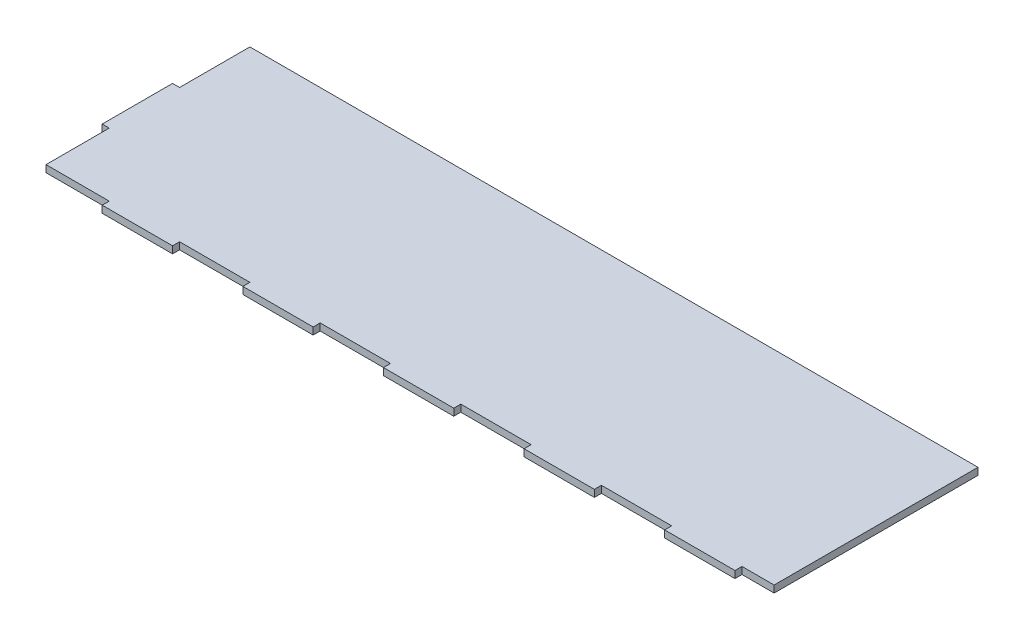
ISO-10303-21;
HEADER;
FILE_DESCRIPTION(('STEP AP214'),'2;1');
FILE_NAME('part.step','',(''),(''),'','','');
FILE_SCHEMA(('AUTOMOTIVE_DESIGN { 1 0 10303 214 1 1 1 1 }'));
ENDSEC;
DATA;
#1=APPLICATION_CONTEXT('core data for automotive mechanical design processes');
#2=APPLICATION_PROTOCOL_DEFINITION('international standard','automotive_design',2000,#1);
#3=PRODUCT_CONTEXT('',#1,'mechanical');
#4=PRODUCT('Part','Part','',(#3));
#5=PRODUCT_RELATED_PRODUCT_CATEGORY('part','',(#4));
#6=PRODUCT_DEFINITION_FORMATION('','',#4);
#7=PRODUCT_DEFINITION_CONTEXT('part definition',#1,'design');
#8=PRODUCT_DEFINITION('design','',#6,#7);
#9=PRODUCT_DEFINITION_SHAPE('','',#8);
#10=(LENGTH_UNIT() NAMED_UNIT(*) SI_UNIT(.MILLI.,.METRE.));
#11=(NAMED_UNIT(*) PLANE_ANGLE_UNIT() SI_UNIT($,.RADIAN.));
#12=(NAMED_UNIT(*) SI_UNIT($,.STERADIAN.) SOLID_ANGLE_UNIT());
#13=UNCERTAINTY_MEASURE_WITH_UNIT(LENGTH_MEASURE(1.E-05),#10,'distance_accuracy_value','');
#14=(GEOMETRIC_REPRESENTATION_CONTEXT(3) GLOBAL_UNCERTAINTY_ASSIGNED_CONTEXT((#13)) GLOBAL_UNIT_ASSIGNED_CONTEXT((#10,
#11,#12)) REPRESENTATION_CONTEXT('',''));
#15=CARTESIAN_POINT('',(0.,0.,0.));
#16=DIRECTION('',(0.,0.,1.));
#17=DIRECTION('',(1.,0.,0.));
#18=AXIS2_PLACEMENT_3D('',#15,#16,#17);
#19=CARTESIAN_POINT('',(-1.29499999999999,0.,0.));
#20=DIRECTION('',(1.,0.,0.));
#21=DIRECTION('',(0.,0.,-1.));
#22=AXIS2_PLACEMENT_3D('',#19,#20,#21);
#23=PLANE('',#22);
#24=DIRECTION('',(0.,0.,1.));
#25=VECTOR('',#24,1.);
#26=CARTESIAN_POINT('',(-1.29499999999999,0.,0.));
#27=LINE('',#26,#25);
#28=CARTESIAN_POINT('',(-1.29499999999999,0.,-45.));
#29=VERTEX_POINT('',#28);
#30=CARTESIAN_POINT('',(-1.29499999999999,0.,42.));
#31=VERTEX_POINT('',#30);
#32=EDGE_CURVE('E241',#29,#31,#27,.T.);
#33=ORIENTED_EDGE('',*,*,#32,.F.);
#34=DIRECTION('',(0.,1.,0.));
#35=VECTOR('',#34,1.);
#36=CARTESIAN_POINT('',(-1.29499999999999,3.,-45.));
#37=LINE('',#36,#35);
#38=CARTESIAN_POINT('',(-1.29499999999999,3.,-45.));
#39=VERTEX_POINT('',#38);
#40=EDGE_CURVE('E65',#29,#39,#37,.T.);
#41=ORIENTED_EDGE('',*,*,#40,.T.);
#42=DIRECTION('',(0.,0.,1.));
#43=VECTOR('',#42,1.);
#44=CARTESIAN_POINT('',(-1.29499999999999,3.,0.));
#45=LINE('',#44,#43);
#46=CARTESIAN_POINT('',(-1.29499999999999,3.,42.));
#47=VERTEX_POINT('',#46);
#48=EDGE_CURVE('E58',#39,#47,#45,.T.);
#49=ORIENTED_EDGE('',*,*,#48,.T.);
#50=DIRECTION('',(0.,-1.,0.));
#51=VECTOR('',#50,1.);
#52=CARTESIAN_POINT('',(-1.29499999999999,0.,42.));
#53=LINE('',#52,#51);
#54=EDGE_CURVE('E12',#47,#31,#53,.T.);
#55=ORIENTED_EDGE('',*,*,#54,.T.);
#56=EDGE_LOOP('',(#33,#41,#49,#55));
#57=FACE_BOUND('',#56,.T.);
#58=ADVANCED_FACE('F42',(#57),#23,.T.);
#59=CARTESIAN_POINT('',(-315.,3.,-45.));
#60=DIRECTION('',(0.,0.,1.));
#61=DIRECTION('',(1.,0.,0.));
#62=AXIS2_PLACEMENT_3D('',#59,#60,#61);
#63=PLANE('',#62);
#64=ORIENTED_EDGE('',*,*,#40,.F.);
#65=DIRECTION('',(-1.,0.,0.));
#66=VECTOR('',#65,1.);
#67=CARTESIAN_POINT('',(-315.,0.,-45.));
#68=LINE('',#67,#66);
#69=CARTESIAN_POINT('',(-312.,0.,-45.));
#70=VERTEX_POINT('',#69);
#71=EDGE_CURVE('E244',#29,#70,#68,.T.);
#72=ORIENTED_EDGE('',*,*,#71,.T.);
#73=DIRECTION('',(0.,1.,0.));
#74=VECTOR('',#73,1.);
#75=CARTESIAN_POINT('',(-312.,0.,-45.));
#76=LINE('',#75,#74);
#77=CARTESIAN_POINT('',(-312.,3.,-45.));
#78=VERTEX_POINT('',#77);
#79=EDGE_CURVE('E286',#70,#78,#76,.T.);
#80=ORIENTED_EDGE('',*,*,#79,.T.);
#81=DIRECTION('',(-1.,0.,0.));
#82=VECTOR('',#81,1.);
#83=CARTESIAN_POINT('',(-315.,3.,-45.));
#84=LINE('',#83,#82);
#85=EDGE_CURVE('E475',#39,#78,#84,.T.);
#86=ORIENTED_EDGE('',*,*,#85,.F.);
#87=EDGE_LOOP('',(#64,#72,#80,#86));
#88=FACE_BOUND('',#87,.T.);
#89=ADVANCED_FACE('F44',(#88),#63,.F.);
#90=CARTESIAN_POINT('',(0.,3.,0.));
#91=DIRECTION('',(0.,-1.,0.));
#92=DIRECTION('',(0.,0.,-1.));
#93=AXIS2_PLACEMENT_3D('',#90,#91,#92);
#94=PLANE('',#93);
#95=ORIENTED_EDGE('',*,*,#48,.F.);
#96=ORIENTED_EDGE('',*,*,#85,.T.);
#97=DIRECTION('',(0.,0.,-1.));
#98=VECTOR('',#97,1.);
#99=CARTESIAN_POINT('',(-312.,3.,-45.));
#100=LINE('',#99,#98);
#101=CARTESIAN_POINT('',(-312.,3.,-15.));
#102=VERTEX_POINT('',#101);
#103=EDGE_CURVE('E276',#102,#78,#100,.T.);
#104=ORIENTED_EDGE('',*,*,#103,.F.);
#105=DIRECTION('',(1.,0.,0.));
#106=VECTOR('',#105,1.);
#107=CARTESIAN_POINT('',(-315.,3.,-15.));
#108=LINE('',#107,#106);
#109=CARTESIAN_POINT('',(-315.,3.,-15.));
#110=VERTEX_POINT('',#109);
#111=EDGE_CURVE('E270',#110,#102,#108,.T.);
#112=ORIENTED_EDGE('',*,*,#111,.F.);
#113=DIRECTION('',(0.,0.,1.));
#114=VECTOR('',#113,1.);
#115=CARTESIAN_POINT('',(-315.,3.,45.));
#116=LINE('',#115,#114);
#117=CARTESIAN_POINT('',(-315.,3.,15.));
#118=VERTEX_POINT('',#117);
#119=EDGE_CURVE('E478',#110,#118,#116,.T.);
#120=ORIENTED_EDGE('',*,*,#119,.T.);
#121=DIRECTION('',(-1.,0.,0.));
#122=VECTOR('',#121,1.);
#123=CARTESIAN_POINT('',(-315.,3.,15.));
#124=LINE('',#123,#122);
#125=CARTESIAN_POINT('',(-312.,3.,15.));
#126=VERTEX_POINT('',#125);
#127=EDGE_CURVE('E257',#126,#118,#124,.T.);
#128=ORIENTED_EDGE('',*,*,#127,.F.);
#129=DIRECTION('',(0.,0.,-1.));
#130=VECTOR('',#129,1.);
#131=CARTESIAN_POINT('',(-312.,3.,42.));
#132=LINE('',#131,#130);
#133=CARTESIAN_POINT('',(-312.,3.,42.));
#134=VERTEX_POINT('',#133);
#135=EDGE_CURVE('E251',#134,#126,#132,.T.);
#136=ORIENTED_EDGE('',*,*,#135,.F.);
#137=DIRECTION('',(-1.,0.,0.));
#138=VECTOR('',#137,1.);
#139=CARTESIAN_POINT('',(-315.,3.,42.));
#140=LINE('',#139,#138);
#141=CARTESIAN_POINT('',(-285.,3.,42.));
#142=VERTEX_POINT('',#141);
#143=EDGE_CURVE('E388',#142,#134,#140,.T.);
#144=ORIENTED_EDGE('',*,*,#143,.F.);
#145=DIRECTION('',(0.,0.,-1.));
#146=VECTOR('',#145,1.);
#147=CARTESIAN_POINT('',(-285.,3.,45.));
#148=LINE('',#147,#146);
#149=CARTESIAN_POINT('',(-285.,3.,45.));
#150=VERTEX_POINT('',#149);
#151=EDGE_CURVE('E290',#150,#142,#148,.T.);
#152=ORIENTED_EDGE('',*,*,#151,.F.);
#153=DIRECTION('',(1.,0.,0.));
#154=VECTOR('',#153,1.);
#155=CARTESIAN_POINT('',(-315.,3.,45.));
#156=LINE('',#155,#154);
#157=CARTESIAN_POINT('',(-255.,3.,45.));
#158=VERTEX_POINT('',#157);
#159=EDGE_CURVE('E504',#150,#158,#156,.T.);
#160=ORIENTED_EDGE('',*,*,#159,.T.);
#161=DIRECTION('',(0.,0.,1.));
#162=VECTOR('',#161,1.);
#163=CARTESIAN_POINT('',(-255.,3.,45.));
#164=LINE('',#163,#162);
#165=CARTESIAN_POINT('',(-255.,3.,42.));
#166=VERTEX_POINT('',#165);
#167=EDGE_CURVE('E429',#166,#158,#164,.T.);
#168=ORIENTED_EDGE('',*,*,#167,.F.);
#169=DIRECTION('',(-1.,0.,0.));
#170=VECTOR('',#169,1.);
#171=CARTESIAN_POINT('',(-255.,3.,42.));
#172=LINE('',#171,#170);
#173=CARTESIAN_POINT('',(-225.,3.,42.));
#174=VERTEX_POINT('',#173);
#175=EDGE_CURVE('E444',#174,#166,#172,.T.);
#176=ORIENTED_EDGE('',*,*,#175,.F.);
#177=DIRECTION('',(0.,0.,-1.));
#178=VECTOR('',#177,1.);
#179=CARTESIAN_POINT('',(-225.,3.,45.));
#180=LINE('',#179,#178);
#181=CARTESIAN_POINT('',(-225.,3.,45.));
#182=VERTEX_POINT('',#181);
#183=EDGE_CURVE('E456',#182,#174,#180,.T.);
#184=ORIENTED_EDGE('',*,*,#183,.F.);
#185=CARTESIAN_POINT('',(-195.,3.,45.));
#186=VERTEX_POINT('',#185);
#187=EDGE_CURVE('E488',#182,#186,#156,.T.);
#188=ORIENTED_EDGE('',*,*,#187,.T.);
#189=DIRECTION('',(0.,0.,1.));
#190=VECTOR('',#189,1.);
#191=CARTESIAN_POINT('',(-195.,3.,45.));
#192=LINE('',#191,#190);
#193=CARTESIAN_POINT('',(-195.,3.,42.));
#194=VERTEX_POINT('',#193);
#195=EDGE_CURVE('E324',#194,#186,#192,.T.);
#196=ORIENTED_EDGE('',*,*,#195,.F.);
#197=DIRECTION('',(-1.,0.,0.));
#198=VECTOR('',#197,1.);
#199=CARTESIAN_POINT('',(-195.,3.,42.));
#200=LINE('',#199,#198);
#201=CARTESIAN_POINT('',(-165.,3.,42.));
#202=VERTEX_POINT('',#201);
#203=EDGE_CURVE('E408',#202,#194,#200,.T.);
#204=ORIENTED_EDGE('',*,*,#203,.F.);
#205=DIRECTION('',(0.,0.,-1.));
#206=VECTOR('',#205,1.);
#207=CARTESIAN_POINT('',(-165.,3.,45.));
#208=LINE('',#207,#206);
#209=CARTESIAN_POINT('',(-165.,3.,45.));
#210=VERTEX_POINT('',#209);
#211=EDGE_CURVE('E419',#210,#202,#208,.T.);
#212=ORIENTED_EDGE('',*,*,#211,.F.);
#213=CARTESIAN_POINT('',(-135.,3.,45.));
#214=VERTEX_POINT('',#213);
#215=EDGE_CURVE('E636',#210,#214,#156,.T.);
#216=ORIENTED_EDGE('',*,*,#215,.T.);
#217=DIRECTION('',(0.,0.,1.));
#218=VECTOR('',#217,1.);
#219=CARTESIAN_POINT('',(-135.,3.,45.));
#220=LINE('',#219,#218);
#221=CARTESIAN_POINT('',(-135.,3.,42.));
#222=VERTEX_POINT('',#221);
#223=EDGE_CURVE('E310',#222,#214,#220,.T.);
#224=ORIENTED_EDGE('',*,*,#223,.F.);
#225=DIRECTION('',(-1.,0.,0.));
#226=VECTOR('',#225,1.);
#227=CARTESIAN_POINT('',(-135.,3.,42.));
#228=LINE('',#227,#226);
#229=CARTESIAN_POINT('',(-105.,3.,42.));
#230=VERTEX_POINT('',#229);
#231=EDGE_CURVE('E301',#230,#222,#228,.T.);
#232=ORIENTED_EDGE('',*,*,#231,.F.);
#233=DIRECTION('',(0.,0.,-1.));
#234=VECTOR('',#233,1.);
#235=CARTESIAN_POINT('',(-105.,3.,45.));
#236=LINE('',#235,#234);
#237=CARTESIAN_POINT('',(-105.,3.,45.));
#238=VERTEX_POINT('',#237);
#239=EDGE_CURVE('E313',#238,#230,#236,.T.);
#240=ORIENTED_EDGE('',*,*,#239,.F.);
#241=CARTESIAN_POINT('',(-75.,3.,45.));
#242=VERTEX_POINT('',#241);
#243=EDGE_CURVE('E487',#238,#242,#156,.T.);
#244=ORIENTED_EDGE('',*,*,#243,.T.);
#245=DIRECTION('',(0.,0.,1.));
#246=VECTOR('',#245,1.);
#247=CARTESIAN_POINT('',(-75.,3.,45.));
#248=LINE('',#247,#246);
#249=CARTESIAN_POINT('',(-75.,3.,42.));
#250=VERTEX_POINT('',#249);
#251=EDGE_CURVE('E348',#250,#242,#248,.T.);
#252=ORIENTED_EDGE('',*,*,#251,.F.);
#253=DIRECTION('',(-1.,0.,0.));
#254=VECTOR('',#253,1.);
#255=CARTESIAN_POINT('',(-75.,3.,42.));
#256=LINE('',#255,#254);
#257=CARTESIAN_POINT('',(-45.,3.,42.));
#258=VERTEX_POINT('',#257);
#259=EDGE_CURVE('E339',#258,#250,#256,.T.);
#260=ORIENTED_EDGE('',*,*,#259,.F.);
#261=DIRECTION('',(0.,0.,-1.));
#262=VECTOR('',#261,1.);
#263=CARTESIAN_POINT('',(-45.,3.,45.));
#264=LINE('',#263,#262);
#265=CARTESIAN_POINT('',(-45.,3.,45.));
#266=VERTEX_POINT('',#265);
#267=EDGE_CURVE('E351',#266,#258,#264,.T.);
#268=ORIENTED_EDGE('',*,*,#267,.F.);
#269=CARTESIAN_POINT('',(-15.,3.,45.));
#270=VERTEX_POINT('',#269);
#271=EDGE_CURVE('E483',#266,#270,#156,.T.);
#272=ORIENTED_EDGE('',*,*,#271,.T.);
#273=DIRECTION('',(0.,0.,1.));
#274=VECTOR('',#273,1.);
#275=CARTESIAN_POINT('',(-15.,3.,45.));
#276=LINE('',#275,#274);
#277=CARTESIAN_POINT('',(-15.,3.,42.));
#278=VERTEX_POINT('',#277);
#279=EDGE_CURVE('E372',#278,#270,#276,.T.);
#280=ORIENTED_EDGE('',*,*,#279,.F.);
#281=DIRECTION('',(-1.,0.,0.));
#282=VECTOR('',#281,1.);
#283=CARTESIAN_POINT('',(-15.,3.,42.));
#284=LINE('',#283,#282);
#285=EDGE_CURVE('E370',#47,#278,#284,.T.);
#286=ORIENTED_EDGE('',*,*,#285,.F.);
#287=EDGE_LOOP('',(#95,#96,#104,#112,#120,#128,#136,#144,#152,#160,#168,#176,#184,#188,#196,
#204,#212,#216,#224,#232,#240,#244,#252,#260,#268,#272,#280,#286));
#288=FACE_BOUND('',#287,.T.);
#289=ADVANCED_FACE('F526',(#288),#94,.F.);
#290=CARTESIAN_POINT('',(0.,0.,0.));
#291=DIRECTION('',(0.,-1.,0.));
#292=DIRECTION('',(0.,0.,-1.));
#293=AXIS2_PLACEMENT_3D('',#290,#291,#292);
#294=PLANE('',#293);
#295=ORIENTED_EDGE('',*,*,#71,.F.);
#296=ORIENTED_EDGE('',*,*,#32,.T.);
#297=DIRECTION('',(-1.,0.,0.));
#298=VECTOR('',#297,1.);
#299=CARTESIAN_POINT('',(-15.,0.,42.));
#300=LINE('',#299,#298);
#301=CARTESIAN_POINT('',(-15.,0.,42.));
#302=VERTEX_POINT('',#301);
#303=EDGE_CURVE('E228',#31,#302,#300,.T.);
#304=ORIENTED_EDGE('',*,*,#303,.T.);
#305=DIRECTION('',(0.,0.,1.));
#306=VECTOR('',#305,1.);
#307=CARTESIAN_POINT('',(-15.,0.,45.));
#308=LINE('',#307,#306);
#309=CARTESIAN_POINT('',(-15.,0.,45.));
#310=VERTEX_POINT('',#309);
#311=EDGE_CURVE('E238',#302,#310,#308,.T.);
#312=ORIENTED_EDGE('',*,*,#311,.T.);
#313=DIRECTION('',(1.,0.,0.));
#314=VECTOR('',#313,1.);
#315=CARTESIAN_POINT('',(-315.,0.,45.));
#316=LINE('',#315,#314);
#317=CARTESIAN_POINT('',(-45.,0.,45.));
#318=VERTEX_POINT('',#317);
#319=EDGE_CURVE('E495',#318,#310,#316,.T.);
#320=ORIENTED_EDGE('',*,*,#319,.F.);
#321=DIRECTION('',(0.,0.,-1.));
#322=VECTOR('',#321,1.);
#323=CARTESIAN_POINT('',(-45.,0.,45.));
#324=LINE('',#323,#322);
#325=CARTESIAN_POINT('',(-45.,0.,42.));
#326=VERTEX_POINT('',#325);
#327=EDGE_CURVE('E338',#318,#326,#324,.T.);
#328=ORIENTED_EDGE('',*,*,#327,.T.);
#329=DIRECTION('',(-1.,0.,0.));
#330=VECTOR('',#329,1.);
#331=CARTESIAN_POINT('',(-75.,0.,42.));
#332=LINE('',#331,#330);
#333=CARTESIAN_POINT('',(-75.,0.,42.));
#334=VERTEX_POINT('',#333);
#335=EDGE_CURVE('E343',#326,#334,#332,.T.);
#336=ORIENTED_EDGE('',*,*,#335,.T.);
#337=DIRECTION('',(0.,0.,1.));
#338=VECTOR('',#337,1.);
#339=CARTESIAN_POINT('',(-75.,0.,45.));
#340=LINE('',#339,#338);
#341=CARTESIAN_POINT('',(-75.,0.,45.));
#342=VERTEX_POINT('',#341);
#343=EDGE_CURVE('E334',#334,#342,#340,.T.);
#344=ORIENTED_EDGE('',*,*,#343,.T.);
#345=CARTESIAN_POINT('',(-105.,0.,45.));
#346=VERTEX_POINT('',#345);
#347=EDGE_CURVE('E499',#346,#342,#316,.T.);
#348=ORIENTED_EDGE('',*,*,#347,.F.);
#349=DIRECTION('',(0.,0.,-1.));
#350=VECTOR('',#349,1.);
#351=CARTESIAN_POINT('',(-105.,0.,45.));
#352=LINE('',#351,#350);
#353=CARTESIAN_POINT('',(-105.,0.,42.));
#354=VERTEX_POINT('',#353);
#355=EDGE_CURVE('E300',#346,#354,#352,.T.);
#356=ORIENTED_EDGE('',*,*,#355,.T.);
#357=DIRECTION('',(-1.,0.,0.));
#358=VECTOR('',#357,1.);
#359=CARTESIAN_POINT('',(-135.,0.,42.));
#360=LINE('',#359,#358);
#361=CARTESIAN_POINT('',(-135.,0.,42.));
#362=VERTEX_POINT('',#361);
#363=EDGE_CURVE('E305',#354,#362,#360,.T.);
#364=ORIENTED_EDGE('',*,*,#363,.T.);
#365=DIRECTION('',(0.,0.,1.));
#366=VECTOR('',#365,1.);
#367=CARTESIAN_POINT('',(-135.,0.,45.));
#368=LINE('',#367,#366);
#369=CARTESIAN_POINT('',(-135.,0.,45.));
#370=VERTEX_POINT('',#369);
#371=EDGE_CURVE('E296',#362,#370,#368,.T.);
#372=ORIENTED_EDGE('',*,*,#371,.T.);
#373=CARTESIAN_POINT('',(-165.,0.,45.));
#374=VERTEX_POINT('',#373);
#375=EDGE_CURVE('E663',#374,#370,#316,.T.);
#376=ORIENTED_EDGE('',*,*,#375,.F.);
#377=DIRECTION('',(0.,0.,-1.));
#378=VECTOR('',#377,1.);
#379=CARTESIAN_POINT('',(-165.,0.,45.));
#380=LINE('',#379,#378);
#381=CARTESIAN_POINT('',(-165.,0.,42.));
#382=VERTEX_POINT('',#381);
#383=EDGE_CURVE('E407',#374,#382,#380,.T.);
#384=ORIENTED_EDGE('',*,*,#383,.T.);
#385=DIRECTION('',(-1.,0.,0.));
#386=VECTOR('',#385,1.);
#387=CARTESIAN_POINT('',(-195.,0.,42.));
#388=LINE('',#387,#386);
#389=CARTESIAN_POINT('',(-195.,0.,42.));
#390=VERTEX_POINT('',#389);
#391=EDGE_CURVE('E412',#382,#390,#388,.T.);
#392=ORIENTED_EDGE('',*,*,#391,.T.);
#393=DIRECTION('',(0.,0.,1.));
#394=VECTOR('',#393,1.);
#395=CARTESIAN_POINT('',(-195.,0.,45.));
#396=LINE('',#395,#394);
#397=CARTESIAN_POINT('',(-195.,0.,45.));
#398=VERTEX_POINT('',#397);
#399=EDGE_CURVE('E403',#390,#398,#396,.T.);
#400=ORIENTED_EDGE('',*,*,#399,.T.);
#401=CARTESIAN_POINT('',(-225.,0.,45.));
#402=VERTEX_POINT('',#401);
#403=EDGE_CURVE('E500',#402,#398,#316,.T.);
#404=ORIENTED_EDGE('',*,*,#403,.F.);
#405=DIRECTION('',(0.,0.,-1.));
#406=VECTOR('',#405,1.);
#407=CARTESIAN_POINT('',(-225.,0.,45.));
#408=LINE('',#407,#406);
#409=CARTESIAN_POINT('',(-225.,0.,42.));
#410=VERTEX_POINT('',#409);
#411=EDGE_CURVE('E443',#402,#410,#408,.T.);
#412=ORIENTED_EDGE('',*,*,#411,.T.);
#413=DIRECTION('',(-1.,0.,0.));
#414=VECTOR('',#413,1.);
#415=CARTESIAN_POINT('',(-255.,0.,42.));
#416=LINE('',#415,#414);
#417=CARTESIAN_POINT('',(-255.,0.,42.));
#418=VERTEX_POINT('',#417);
#419=EDGE_CURVE('E448',#410,#418,#416,.T.);
#420=ORIENTED_EDGE('',*,*,#419,.T.);
#421=DIRECTION('',(0.,0.,1.));
#422=VECTOR('',#421,1.);
#423=CARTESIAN_POINT('',(-255.,0.,45.));
#424=LINE('',#423,#422);
#425=CARTESIAN_POINT('',(-255.,0.,45.));
#426=VERTEX_POINT('',#425);
#427=EDGE_CURVE('E439',#418,#426,#424,.T.);
#428=ORIENTED_EDGE('',*,*,#427,.T.);
#429=CARTESIAN_POINT('',(-285.,0.,45.));
#430=VERTEX_POINT('',#429);
#431=EDGE_CURVE('E479',#430,#426,#316,.T.);
#432=ORIENTED_EDGE('',*,*,#431,.F.);
#433=DIRECTION('',(0.,0.,-1.));
#434=VECTOR('',#433,1.);
#435=CARTESIAN_POINT('',(-285.,0.,45.));
#436=LINE('',#435,#434);
#437=CARTESIAN_POINT('',(-285.,0.,42.));
#438=VERTEX_POINT('',#437);
#439=EDGE_CURVE('E383',#430,#438,#436,.T.);
#440=ORIENTED_EDGE('',*,*,#439,.T.);
#441=DIRECTION('',(-1.,0.,0.));
#442=VECTOR('',#441,1.);
#443=CARTESIAN_POINT('',(-315.,0.,42.));
#444=LINE('',#443,#442);
#445=CARTESIAN_POINT('',(-312.,0.,42.));
#446=VERTEX_POINT('',#445);
#447=EDGE_CURVE('E387',#438,#446,#444,.T.);
#448=ORIENTED_EDGE('',*,*,#447,.T.);
#449=DIRECTION('',(0.,0.,1.));
#450=VECTOR('',#449,1.);
#451=CARTESIAN_POINT('',(-312.,0.,0.));
#452=LINE('',#451,#450);
#453=CARTESIAN_POINT('',(-312.,0.,15.));
#454=VERTEX_POINT('',#453);
#455=EDGE_CURVE('E265',#454,#446,#452,.T.);
#456=ORIENTED_EDGE('',*,*,#455,.F.);
#457=DIRECTION('',(1.,0.,0.));
#458=VECTOR('',#457,1.);
#459=CARTESIAN_POINT('',(0.,0.,15.));
#460=LINE('',#459,#458);
#461=CARTESIAN_POINT('',(-315.,0.,15.));
#462=VERTEX_POINT('',#461);
#463=EDGE_CURVE('E51',#462,#454,#460,.T.);
#464=ORIENTED_EDGE('',*,*,#463,.F.);
#465=DIRECTION('',(0.,0.,1.));
#466=VECTOR('',#465,1.);
#467=CARTESIAN_POINT('',(-315.,0.,45.));
#468=LINE('',#467,#466);
#469=CARTESIAN_POINT('',(-315.,0.,-15.));
#470=VERTEX_POINT('',#469);
#471=EDGE_CURVE('E491',#470,#462,#468,.T.);
#472=ORIENTED_EDGE('',*,*,#471,.F.);
#473=DIRECTION('',(1.,0.,0.));
#474=VECTOR('',#473,1.);
#475=CARTESIAN_POINT('',(-315.,0.,-15.));
#476=LINE('',#475,#474);
#477=CARTESIAN_POINT('',(-312.,0.,-15.));
#478=VERTEX_POINT('',#477);
#479=EDGE_CURVE('E271',#470,#478,#476,.T.);
#480=ORIENTED_EDGE('',*,*,#479,.T.);
#481=DIRECTION('',(0.,0.,-1.));
#482=VECTOR('',#481,1.);
#483=CARTESIAN_POINT('',(-312.,0.,-45.));
#484=LINE('',#483,#482);
#485=EDGE_CURVE('E275',#478,#70,#484,.T.);
#486=ORIENTED_EDGE('',*,*,#485,.T.);
#487=EDGE_LOOP('',(#295,#296,#304,#312,#320,#328,#336,#344,#348,#356,#364,#372,#376,#384,#392,
#400,#404,#412,#420,#428,#432,#440,#448,#456,#464,#472,#480,#486));
#488=FACE_BOUND('',#487,.T.);
#489=ADVANCED_FACE('F242',(#488),#294,.T.);
#490=CARTESIAN_POINT('',(-15.,0.,42.));
#491=DIRECTION('',(0.,0.,-1.));
#492=DIRECTION('',(-1.,0.,0.));
#493=AXIS2_PLACEMENT_3D('',#490,#491,#492);
#494=PLANE('',#493);
#495=ORIENTED_EDGE('',*,*,#54,.F.);
#496=ORIENTED_EDGE('',*,*,#285,.T.);
#497=DIRECTION('',(0.,1.,0.));
#498=VECTOR('',#497,1.);
#499=CARTESIAN_POINT('',(-15.,0.,42.));
#500=LINE('',#499,#498);
#501=EDGE_CURVE('E232',#302,#278,#500,.T.);
#502=ORIENTED_EDGE('',*,*,#501,.F.);
#503=ORIENTED_EDGE('',*,*,#303,.F.);
#504=EDGE_LOOP('',(#495,#496,#502,#503));
#505=FACE_BOUND('',#504,.T.);
#506=ADVANCED_FACE('F230',(#505),#494,.F.);
#507=CARTESIAN_POINT('',(-315.,3.,45.));
#508=DIRECTION('',(0.,0.,-1.));
#509=DIRECTION('',(-1.,0.,0.));
#510=AXIS2_PLACEMENT_3D('',#507,#508,#509);
#511=PLANE('',#510);
#512=ORIENTED_EDGE('',*,*,#319,.T.);
#513=DIRECTION('',(0.,1.,0.));
#514=VECTOR('',#513,1.);
#515=CARTESIAN_POINT('',(-15.,0.,45.));
#516=LINE('',#515,#514);
#517=EDGE_CURVE('E237',#310,#270,#516,.T.);
#518=ORIENTED_EDGE('',*,*,#517,.T.);
#519=ORIENTED_EDGE('',*,*,#271,.F.);
#520=DIRECTION('',(0.,1.,0.));
#521=VECTOR('',#520,1.);
#522=CARTESIAN_POINT('',(-45.,0.,45.));
#523=LINE('',#522,#521);
#524=EDGE_CURVE('E363',#318,#266,#523,.T.);
#525=ORIENTED_EDGE('',*,*,#524,.F.);
#526=EDGE_LOOP('',(#512,#518,#519,#525));
#527=FACE_BOUND('',#526,.T.);
#528=ADVANCED_FACE('F585',(#527),#511,.F.);
#529=ORIENTED_EDGE('',*,*,#347,.T.);
#530=DIRECTION('',(0.,1.,0.));
#531=VECTOR('',#530,1.);
#532=CARTESIAN_POINT('',(-75.,0.,45.));
#533=LINE('',#532,#531);
#534=EDGE_CURVE('E347',#342,#242,#533,.T.);
#535=ORIENTED_EDGE('',*,*,#534,.T.);
#536=ORIENTED_EDGE('',*,*,#243,.F.);
#537=DIRECTION('',(0.,1.,0.));
#538=VECTOR('',#537,1.);
#539=CARTESIAN_POINT('',(-105.,0.,45.));
#540=LINE('',#539,#538);
#541=EDGE_CURVE('E328',#346,#238,#540,.T.);
#542=ORIENTED_EDGE('',*,*,#541,.F.);
#543=EDGE_LOOP('',(#529,#535,#536,#542));
#544=FACE_BOUND('',#543,.T.);
#545=ADVANCED_FACE('F619',(#544),#511,.F.);
#546=ORIENTED_EDGE('',*,*,#375,.T.);
#547=DIRECTION('',(0.,1.,0.));
#548=VECTOR('',#547,1.);
#549=CARTESIAN_POINT('',(-135.,0.,45.));
#550=LINE('',#549,#548);
#551=EDGE_CURVE('E309',#370,#214,#550,.T.);
#552=ORIENTED_EDGE('',*,*,#551,.T.);
#553=ORIENTED_EDGE('',*,*,#215,.F.);
#554=DIRECTION('',(0.,1.,0.));
#555=VECTOR('',#554,1.);
#556=CARTESIAN_POINT('',(-165.,0.,45.));
#557=LINE('',#556,#555);
#558=EDGE_CURVE('E433',#374,#210,#557,.T.);
#559=ORIENTED_EDGE('',*,*,#558,.F.);
#560=EDGE_LOOP('',(#546,#552,#553,#559));
#561=FACE_BOUND('',#560,.T.);
#562=ADVANCED_FACE('F631',(#561),#511,.F.);
#563=ORIENTED_EDGE('',*,*,#403,.T.);
#564=DIRECTION('',(0.,1.,0.));
#565=VECTOR('',#564,1.);
#566=CARTESIAN_POINT('',(-195.,0.,45.));
#567=LINE('',#566,#565);
#568=EDGE_CURVE('E416',#398,#186,#567,.T.);
#569=ORIENTED_EDGE('',*,*,#568,.T.);
#570=ORIENTED_EDGE('',*,*,#187,.F.);
#571=DIRECTION('',(0.,1.,0.));
#572=VECTOR('',#571,1.);
#573=CARTESIAN_POINT('',(-225.,0.,45.));
#574=LINE('',#573,#572);
#575=EDGE_CURVE('E469',#402,#182,#574,.T.);
#576=ORIENTED_EDGE('',*,*,#575,.F.);
#577=EDGE_LOOP('',(#563,#569,#570,#576));
#578=FACE_BOUND('',#577,.T.);
#579=ADVANCED_FACE('F626',(#578),#511,.F.);
#580=ORIENTED_EDGE('',*,*,#159,.F.);
#581=DIRECTION('',(0.,1.,0.));
#582=VECTOR('',#581,1.);
#583=CARTESIAN_POINT('',(-285.,0.,45.));
#584=LINE('',#583,#582);
#585=EDGE_CURVE('E392',#430,#150,#584,.T.);
#586=ORIENTED_EDGE('',*,*,#585,.F.);
#587=ORIENTED_EDGE('',*,*,#431,.T.);
#588=DIRECTION('',(0.,1.,0.));
#589=VECTOR('',#588,1.);
#590=CARTESIAN_POINT('',(-255.,0.,45.));
#591=LINE('',#590,#589);
#592=EDGE_CURVE('E452',#426,#158,#591,.T.);
#593=ORIENTED_EDGE('',*,*,#592,.T.);
#594=EDGE_LOOP('',(#580,#586,#587,#593));
#595=FACE_BOUND('',#594,.T.);
#596=ADVANCED_FACE('F621',(#595),#511,.F.);
#597=CARTESIAN_POINT('',(-315.,3.,45.));
#598=DIRECTION('',(1.,0.,0.));
#599=DIRECTION('',(0.,0.,-1.));
#600=AXIS2_PLACEMENT_3D('',#597,#598,#599);
#601=PLANE('',#600);
#602=ORIENTED_EDGE('',*,*,#471,.T.);
#603=DIRECTION('',(0.,1.,0.));
#604=VECTOR('',#603,1.);
#605=CARTESIAN_POINT('',(-315.,-7.,15.));
#606=LINE('',#605,#604);
#607=EDGE_CURVE('E261',#462,#118,#606,.T.);
#608=ORIENTED_EDGE('',*,*,#607,.T.);
#609=ORIENTED_EDGE('',*,*,#119,.F.);
#610=DIRECTION('',(0.,1.,0.));
#611=VECTOR('',#610,1.);
#612=CARTESIAN_POINT('',(-315.,0.,-15.));
#613=LINE('',#612,#611);
#614=EDGE_CURVE('E279',#470,#110,#613,.T.);
#615=ORIENTED_EDGE('',*,*,#614,.F.);
#616=EDGE_LOOP('',(#602,#608,#609,#615));
#617=FACE_BOUND('',#616,.T.);
#618=ADVANCED_FACE('F530',(#617),#601,.F.);
#619=CARTESIAN_POINT('',(-255.,0.,45.));
#620=DIRECTION('',(-1.,0.,0.));
#621=DIRECTION('',(0.,0.,1.));
#622=AXIS2_PLACEMENT_3D('',#619,#620,#621);
#623=PLANE('',#622);
#624=ORIENTED_EDGE('',*,*,#167,.T.);
#625=ORIENTED_EDGE('',*,*,#592,.F.);
#626=ORIENTED_EDGE('',*,*,#427,.F.);
#627=DIRECTION('',(0.,1.,0.));
#628=VECTOR('',#627,1.);
#629=CARTESIAN_POINT('',(-255.,0.,42.));
#630=LINE('',#629,#628);
#631=EDGE_CURVE('E463',#418,#166,#630,.T.);
#632=ORIENTED_EDGE('',*,*,#631,.T.);
#633=EDGE_LOOP('',(#624,#625,#626,#632));
#634=FACE_BOUND('',#633,.T.);
#635=ADVANCED_FACE('F608',(#634),#623,.F.);
#636=CARTESIAN_POINT('',(-255.,0.,42.));
#637=DIRECTION('',(0.,0.,-1.));
#638=DIRECTION('',(-1.,0.,0.));
#639=AXIS2_PLACEMENT_3D('',#636,#637,#638);
#640=PLANE('',#639);
#641=ORIENTED_EDGE('',*,*,#175,.T.);
#642=ORIENTED_EDGE('',*,*,#631,.F.);
#643=ORIENTED_EDGE('',*,*,#419,.F.);
#644=DIRECTION('',(0.,1.,0.));
#645=VECTOR('',#644,1.);
#646=CARTESIAN_POINT('',(-225.,0.,42.));
#647=LINE('',#646,#645);
#648=EDGE_CURVE('E466',#410,#174,#647,.T.);
#649=ORIENTED_EDGE('',*,*,#648,.T.);
#650=EDGE_LOOP('',(#641,#642,#643,#649));
#651=FACE_BOUND('',#650,.T.);
#652=ADVANCED_FACE('F605',(#651),#640,.F.);
#653=CARTESIAN_POINT('',(-225.,0.,45.));
#654=DIRECTION('',(1.,0.,0.));
#655=DIRECTION('',(0.,0.,-1.));
#656=AXIS2_PLACEMENT_3D('',#653,#654,#655);
#657=PLANE('',#656);
#658=ORIENTED_EDGE('',*,*,#183,.T.);
#659=ORIENTED_EDGE('',*,*,#648,.F.);
#660=ORIENTED_EDGE('',*,*,#411,.F.);
#661=ORIENTED_EDGE('',*,*,#575,.T.);
#662=EDGE_LOOP('',(#658,#659,#660,#661));
#663=FACE_BOUND('',#662,.T.);
#664=ADVANCED_FACE('F603',(#663),#657,.F.);
#665=CARTESIAN_POINT('',(-195.,0.,45.));
#666=DIRECTION('',(-1.,0.,0.));
#667=DIRECTION('',(0.,0.,1.));
#668=AXIS2_PLACEMENT_3D('',#665,#666,#667);
#669=PLANE('',#668);
#670=ORIENTED_EDGE('',*,*,#195,.T.);
#671=ORIENTED_EDGE('',*,*,#568,.F.);
#672=ORIENTED_EDGE('',*,*,#399,.F.);
#673=DIRECTION('',(0.,1.,0.));
#674=VECTOR('',#673,1.);
#675=CARTESIAN_POINT('',(-195.,0.,42.));
#676=LINE('',#675,#674);
#677=EDGE_CURVE('E426',#390,#194,#676,.T.);
#678=ORIENTED_EDGE('',*,*,#677,.T.);
#679=EDGE_LOOP('',(#670,#671,#672,#678));
#680=FACE_BOUND('',#679,.T.);
#681=ADVANCED_FACE('F596',(#680),#669,.F.);
#682=CARTESIAN_POINT('',(-195.,0.,42.));
#683=DIRECTION('',(0.,0.,-1.));
#684=DIRECTION('',(-1.,0.,0.));
#685=AXIS2_PLACEMENT_3D('',#682,#683,#684);
#686=PLANE('',#685);
#687=ORIENTED_EDGE('',*,*,#203,.T.);
#688=ORIENTED_EDGE('',*,*,#677,.F.);
#689=ORIENTED_EDGE('',*,*,#391,.F.);
#690=DIRECTION('',(0.,1.,0.));
#691=VECTOR('',#690,1.);
#692=CARTESIAN_POINT('',(-165.,0.,42.));
#693=LINE('',#692,#691);
#694=EDGE_CURVE('E430',#382,#202,#693,.T.);
#695=ORIENTED_EDGE('',*,*,#694,.T.);
#696=EDGE_LOOP('',(#687,#688,#689,#695));
#697=FACE_BOUND('',#696,.T.);
#698=ADVANCED_FACE('F593',(#697),#686,.F.);
#699=CARTESIAN_POINT('',(-165.,0.,45.));
#700=DIRECTION('',(1.,0.,0.));
#701=DIRECTION('',(0.,0.,-1.));
#702=AXIS2_PLACEMENT_3D('',#699,#700,#701);
#703=PLANE('',#702);
#704=ORIENTED_EDGE('',*,*,#211,.T.);
#705=ORIENTED_EDGE('',*,*,#694,.F.);
#706=ORIENTED_EDGE('',*,*,#383,.F.);
#707=ORIENTED_EDGE('',*,*,#558,.T.);
#708=EDGE_LOOP('',(#704,#705,#706,#707));
#709=FACE_BOUND('',#708,.T.);
#710=ADVANCED_FACE('F569',(#709),#703,.F.);
#711=CARTESIAN_POINT('',(-135.,0.,45.));
#712=DIRECTION('',(-1.,0.,0.));
#713=DIRECTION('',(0.,0.,1.));
#714=AXIS2_PLACEMENT_3D('',#711,#712,#713);
#715=PLANE('',#714);
#716=ORIENTED_EDGE('',*,*,#223,.T.);
#717=ORIENTED_EDGE('',*,*,#551,.F.);
#718=ORIENTED_EDGE('',*,*,#371,.F.);
#719=DIRECTION('',(0.,1.,0.));
#720=VECTOR('',#719,1.);
#721=CARTESIAN_POINT('',(-135.,0.,42.));
#722=LINE('',#721,#720);
#723=EDGE_CURVE('E321',#362,#222,#722,.T.);
#724=ORIENTED_EDGE('',*,*,#723,.T.);
#725=EDGE_LOOP('',(#716,#717,#718,#724));
#726=FACE_BOUND('',#725,.T.);
#727=ADVANCED_FACE('F561',(#726),#715,.F.);
#728=CARTESIAN_POINT('',(-135.,0.,42.));
#729=DIRECTION('',(0.,0.,-1.));
#730=DIRECTION('',(-1.,0.,0.));
#731=AXIS2_PLACEMENT_3D('',#728,#729,#730);
#732=PLANE('',#731);
#733=ORIENTED_EDGE('',*,*,#231,.T.);
#734=ORIENTED_EDGE('',*,*,#723,.F.);
#735=ORIENTED_EDGE('',*,*,#363,.F.);
#736=DIRECTION('',(0.,1.,0.));
#737=VECTOR('',#736,1.);
#738=CARTESIAN_POINT('',(-105.,0.,42.));
#739=LINE('',#738,#737);
#740=EDGE_CURVE('E325',#354,#230,#739,.T.);
#741=ORIENTED_EDGE('',*,*,#740,.T.);
#742=EDGE_LOOP('',(#733,#734,#735,#741));
#743=FACE_BOUND('',#742,.T.);
#744=ADVANCED_FACE('F557',(#743),#732,.F.);
#745=CARTESIAN_POINT('',(-105.,0.,45.));
#746=DIRECTION('',(1.,0.,0.));
#747=DIRECTION('',(0.,0.,-1.));
#748=AXIS2_PLACEMENT_3D('',#745,#746,#747);
#749=PLANE('',#748);
#750=ORIENTED_EDGE('',*,*,#239,.T.);
#751=ORIENTED_EDGE('',*,*,#740,.F.);
#752=ORIENTED_EDGE('',*,*,#355,.F.);
#753=ORIENTED_EDGE('',*,*,#541,.T.);
#754=EDGE_LOOP('',(#750,#751,#752,#753));
#755=FACE_BOUND('',#754,.T.);
#756=ADVANCED_FACE('F560',(#755),#749,.F.);
#757=CARTESIAN_POINT('',(-75.,0.,45.));
#758=DIRECTION('',(-1.,0.,0.));
#759=DIRECTION('',(0.,0.,1.));
#760=AXIS2_PLACEMENT_3D('',#757,#758,#759);
#761=PLANE('',#760);
#762=ORIENTED_EDGE('',*,*,#251,.T.);
#763=ORIENTED_EDGE('',*,*,#534,.F.);
#764=ORIENTED_EDGE('',*,*,#343,.F.);
#765=DIRECTION('',(0.,1.,0.));
#766=VECTOR('',#765,1.);
#767=CARTESIAN_POINT('',(-75.,0.,42.));
#768=LINE('',#767,#766);
#769=EDGE_CURVE('E314',#334,#250,#768,.T.);
#770=ORIENTED_EDGE('',*,*,#769,.T.);
#771=EDGE_LOOP('',(#762,#763,#764,#770));
#772=FACE_BOUND('',#771,.T.);
#773=ADVANCED_FACE('F565',(#772),#761,.F.);
#774=CARTESIAN_POINT('',(-75.,0.,42.));
#775=DIRECTION('',(0.,0.,-1.));
#776=DIRECTION('',(-1.,0.,0.));
#777=AXIS2_PLACEMENT_3D('',#774,#775,#776);
#778=PLANE('',#777);
#779=ORIENTED_EDGE('',*,*,#259,.T.);
#780=ORIENTED_EDGE('',*,*,#769,.F.);
#781=ORIENTED_EDGE('',*,*,#335,.F.);
#782=DIRECTION('',(0.,1.,0.));
#783=VECTOR('',#782,1.);
#784=CARTESIAN_POINT('',(-45.,0.,42.));
#785=LINE('',#784,#783);
#786=EDGE_CURVE('E360',#326,#258,#785,.T.);
#787=ORIENTED_EDGE('',*,*,#786,.T.);
#788=EDGE_LOOP('',(#779,#780,#781,#787));
#789=FACE_BOUND('',#788,.T.);
#790=ADVANCED_FACE('F571',(#789),#778,.F.);
#791=CARTESIAN_POINT('',(-45.,0.,45.));
#792=DIRECTION('',(1.,0.,0.));
#793=DIRECTION('',(0.,0.,-1.));
#794=AXIS2_PLACEMENT_3D('',#791,#792,#793);
#795=PLANE('',#794);
#796=ORIENTED_EDGE('',*,*,#267,.T.);
#797=ORIENTED_EDGE('',*,*,#786,.F.);
#798=ORIENTED_EDGE('',*,*,#327,.F.);
#799=ORIENTED_EDGE('',*,*,#524,.T.);
#800=EDGE_LOOP('',(#796,#797,#798,#799));
#801=FACE_BOUND('',#800,.T.);
#802=ADVANCED_FACE('F574',(#801),#795,.F.);
#803=CARTESIAN_POINT('',(-15.,0.,45.));
#804=DIRECTION('',(-1.,0.,0.));
#805=DIRECTION('',(0.,0.,1.));
#806=AXIS2_PLACEMENT_3D('',#803,#804,#805);
#807=PLANE('',#806);
#808=ORIENTED_EDGE('',*,*,#279,.T.);
#809=ORIENTED_EDGE('',*,*,#517,.F.);
#810=ORIENTED_EDGE('',*,*,#311,.F.);
#811=ORIENTED_EDGE('',*,*,#501,.T.);
#812=EDGE_LOOP('',(#808,#809,#810,#811));
#813=FACE_BOUND('',#812,.T.);
#814=ADVANCED_FACE('F578',(#813),#807,.F.);
#815=CARTESIAN_POINT('',(-315.,0.,42.));
#816=DIRECTION('',(0.,0.,-1.));
#817=DIRECTION('',(-1.,0.,0.));
#818=AXIS2_PLACEMENT_3D('',#815,#816,#817);
#819=PLANE('',#818);
#820=ORIENTED_EDGE('',*,*,#143,.T.);
#821=DIRECTION('',(0.,-1.,0.));
#822=VECTOR('',#821,1.);
#823=CARTESIAN_POINT('',(-312.,0.,42.));
#824=LINE('',#823,#822);
#825=EDGE_CURVE('E501',#134,#446,#824,.T.);
#826=ORIENTED_EDGE('',*,*,#825,.T.);
#827=ORIENTED_EDGE('',*,*,#447,.F.);
#828=DIRECTION('',(0.,1.,0.));
#829=VECTOR('',#828,1.);
#830=CARTESIAN_POINT('',(-285.,0.,42.));
#831=LINE('',#830,#829);
#832=EDGE_CURVE('E375',#438,#142,#831,.T.);
#833=ORIENTED_EDGE('',*,*,#832,.T.);
#834=EDGE_LOOP('',(#820,#826,#827,#833));
#835=FACE_BOUND('',#834,.T.);
#836=ADVANCED_FACE('F519',(#835),#819,.F.);
#837=CARTESIAN_POINT('',(-285.,0.,45.));
#838=DIRECTION('',(1.,0.,0.));
#839=DIRECTION('',(0.,0.,-1.));
#840=AXIS2_PLACEMENT_3D('',#837,#838,#839);
#841=PLANE('',#840);
#842=ORIENTED_EDGE('',*,*,#151,.T.);
#843=ORIENTED_EDGE('',*,*,#832,.F.);
#844=ORIENTED_EDGE('',*,*,#439,.F.);
#845=ORIENTED_EDGE('',*,*,#585,.T.);
#846=EDGE_LOOP('',(#842,#843,#844,#845));
#847=FACE_BOUND('',#846,.T.);
#848=ADVANCED_FACE('F521',(#847),#841,.F.);
#849=CARTESIAN_POINT('',(-312.,0.,-45.));
#850=DIRECTION('',(1.,0.,0.));
#851=DIRECTION('',(0.,0.,-1.));
#852=AXIS2_PLACEMENT_3D('',#849,#850,#851);
#853=PLANE('',#852);
#854=ORIENTED_EDGE('',*,*,#103,.T.);
#855=ORIENTED_EDGE('',*,*,#79,.F.);
#856=ORIENTED_EDGE('',*,*,#485,.F.);
#857=DIRECTION('',(0.,1.,0.));
#858=VECTOR('',#857,1.);
#859=CARTESIAN_POINT('',(-312.,0.,-15.));
#860=LINE('',#859,#858);
#861=EDGE_CURVE('E291',#478,#102,#860,.T.);
#862=ORIENTED_EDGE('',*,*,#861,.T.);
#863=EDGE_LOOP('',(#854,#855,#856,#862));
#864=FACE_BOUND('',#863,.T.);
#865=ADVANCED_FACE('F537',(#864),#853,.F.);
#866=CARTESIAN_POINT('',(-315.,0.,-15.));
#867=DIRECTION('',(0.,0.,1.));
#868=DIRECTION('',(1.,0.,0.));
#869=AXIS2_PLACEMENT_3D('',#866,#867,#868);
#870=PLANE('',#869);
#871=ORIENTED_EDGE('',*,*,#111,.T.);
#872=ORIENTED_EDGE('',*,*,#861,.F.);
#873=ORIENTED_EDGE('',*,*,#479,.F.);
#874=ORIENTED_EDGE('',*,*,#614,.T.);
#875=EDGE_LOOP('',(#871,#872,#873,#874));
#876=FACE_BOUND('',#875,.T.);
#877=ADVANCED_FACE('F534',(#876),#870,.F.);
#878=CARTESIAN_POINT('',(-315.,-7.,15.));
#879=DIRECTION('',(0.,0.,-1.));
#880=DIRECTION('',(-1.,0.,0.));
#881=AXIS2_PLACEMENT_3D('',#878,#879,#880);
#882=PLANE('',#881);
#883=ORIENTED_EDGE('',*,*,#463,.T.);
#884=DIRECTION('',(0.,1.,0.));
#885=VECTOR('',#884,1.);
#886=CARTESIAN_POINT('',(-312.,-7.,15.));
#887=LINE('',#886,#885);
#888=EDGE_CURVE('E260',#454,#126,#887,.T.);
#889=ORIENTED_EDGE('',*,*,#888,.T.);
#890=ORIENTED_EDGE('',*,*,#127,.T.);
#891=ORIENTED_EDGE('',*,*,#607,.F.);
#892=EDGE_LOOP('',(#883,#889,#890,#891));
#893=FACE_BOUND('',#892,.T.);
#894=ADVANCED_FACE('F509',(#893),#882,.F.);
#895=CARTESIAN_POINT('',(-312.,-7.,42.));
#896=DIRECTION('',(1.,0.,0.));
#897=DIRECTION('',(0.,0.,-1.));
#898=AXIS2_PLACEMENT_3D('',#895,#896,#897);
#899=PLANE('',#898);
#900=ORIENTED_EDGE('',*,*,#455,.T.);
#901=ORIENTED_EDGE('',*,*,#825,.F.);
#902=ORIENTED_EDGE('',*,*,#135,.T.);
#903=ORIENTED_EDGE('',*,*,#888,.F.);
#904=EDGE_LOOP('',(#900,#901,#902,#903));
#905=FACE_BOUND('',#904,.T.);
#906=ADVANCED_FACE('F513',(#905),#899,.F.);
#907=CLOSED_SHELL('',(#58,#89,#289,#489,#506,#528,#545,#562,#579,#596,#618,#635,#652,#664,#681,
#698,#710,#727,#744,#756,#773,#790,#802,#814,#836,#848,#865,#877,#894,#906));
#908=MANIFOLD_SOLID_BREP('B2',#907);
#909=ADVANCED_BREP_SHAPE_REPRESENTATION('',(#18,#908),#14);
#910=SHAPE_DEFINITION_REPRESENTATION(#9,#909);
ENDSEC;
END-ISO-10303-21;
